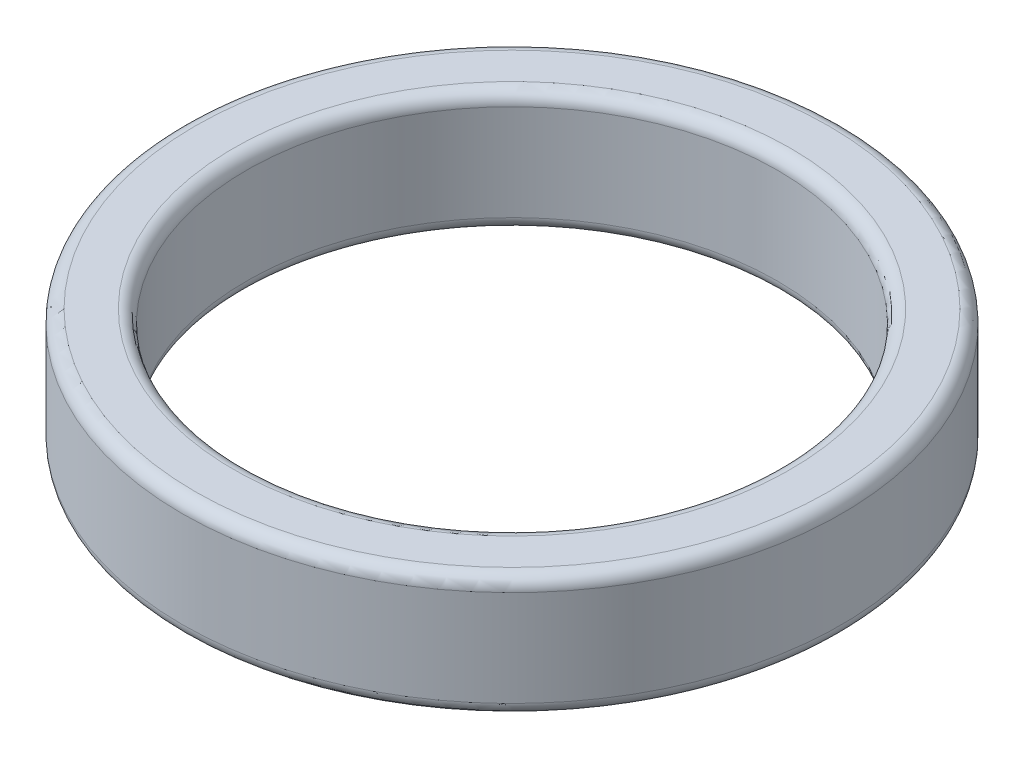
ISO-10303-21;
HEADER;
FILE_DESCRIPTION(('STEP AP214'),'2;1');
FILE_NAME('part.step','',(''),(''),'','','');
FILE_SCHEMA(('AUTOMOTIVE_DESIGN { 1 0 10303 214 1 1 1 1 }'));
ENDSEC;
DATA;
#1=APPLICATION_CONTEXT('core data for automotive mechanical design processes');
#2=APPLICATION_PROTOCOL_DEFINITION('international standard','automotive_design',2000,#1);
#3=PRODUCT_CONTEXT('',#1,'mechanical');
#4=PRODUCT('Part','Part','',(#3));
#5=PRODUCT_RELATED_PRODUCT_CATEGORY('part','',(#4));
#6=PRODUCT_DEFINITION_FORMATION('','',#4);
#7=PRODUCT_DEFINITION_CONTEXT('part definition',#1,'design');
#8=PRODUCT_DEFINITION('design','',#6,#7);
#9=PRODUCT_DEFINITION_SHAPE('','',#8);
#10=(LENGTH_UNIT() NAMED_UNIT(*) SI_UNIT(.MILLI.,.METRE.));
#11=(NAMED_UNIT(*) PLANE_ANGLE_UNIT() SI_UNIT($,.RADIAN.));
#12=(NAMED_UNIT(*) SI_UNIT($,.STERADIAN.) SOLID_ANGLE_UNIT());
#13=UNCERTAINTY_MEASURE_WITH_UNIT(LENGTH_MEASURE(1.E-05),#10,'distance_accuracy_value','');
#14=(GEOMETRIC_REPRESENTATION_CONTEXT(3) GLOBAL_UNCERTAINTY_ASSIGNED_CONTEXT((#13)) GLOBAL_UNIT_ASSIGNED_CONTEXT((#10,
#11,#12)) REPRESENTATION_CONTEXT('',''));
#15=CARTESIAN_POINT('',(0.,0.,0.));
#16=DIRECTION('',(0.,0.,1.));
#17=DIRECTION('',(1.,0.,0.));
#18=AXIS2_PLACEMENT_3D('',#15,#16,#17);
#19=CARTESIAN_POINT('',(0.,2.,0.));
#20=DIRECTION('',(0.,-1.,0.));
#21=DIRECTION('',(0.,0.,-1.));
#22=AXIS2_PLACEMENT_3D('',#19,#20,#21);
#23=TOROIDAL_SURFACE('',#22,4.35,0.2);
#24=CARTESIAN_POINT('',(0.,2.2,0.));
#25=DIRECTION('',(0.,-1.,0.));
#26=DIRECTION('',(0.,0.,-1.));
#27=AXIS2_PLACEMENT_3D('',#24,#25,#26);
#28=CIRCLE('',#27,4.35);
#29=CARTESIAN_POINT('',(0.,2.2,-4.35));
#30=VERTEX_POINT('',#29);
#31=EDGE_CURVE('E10',#30,#30,#28,.T.);
#32=ORIENTED_EDGE('',*,*,#31,.F.);
#33=EDGE_LOOP('',(#32));
#34=FACE_BOUND('',#33,.T.);
#35=CARTESIAN_POINT('',(0.,2.,0.));
#36=DIRECTION('',(0.,-1.,0.));
#37=DIRECTION('',(0.,0.,-1.));
#38=AXIS2_PLACEMENT_3D('',#35,#36,#37);
#39=CIRCLE('',#38,4.15);
#40=CARTESIAN_POINT('',(0.,2.,-4.15));
#41=VERTEX_POINT('',#40);
#42=EDGE_CURVE('E60',#41,#41,#39,.T.);
#43=ORIENTED_EDGE('',*,*,#42,.T.);
#44=EDGE_LOOP('',(#43));
#45=FACE_BOUND('',#44,.T.);
#46=ADVANCED_FACE('F32',(#34,#45),#23,.T.);
#47=CARTESIAN_POINT('',(-4.95,2.2,0.));
#48=DIRECTION('',(0.,-1.,0.));
#49=DIRECTION('',(0.,0.,-1.));
#50=AXIS2_PLACEMENT_3D('',#47,#48,#49);
#51=PLANE('',#50);
#52=CARTESIAN_POINT('',(0.,2.2,0.));
#53=DIRECTION('',(0.,-1.,0.));
#54=DIRECTION('',(0.,0.,-1.));
#55=AXIS2_PLACEMENT_3D('',#52,#53,#54);
#56=CIRCLE('',#55,4.95);
#57=CARTESIAN_POINT('',(0.,2.2,-4.95));
#58=VERTEX_POINT('',#57);
#59=EDGE_CURVE('E38',#58,#58,#56,.T.);
#60=ORIENTED_EDGE('',*,*,#59,.F.);
#61=EDGE_LOOP('',(#60));
#62=FACE_BOUND('',#61,.T.);
#63=ORIENTED_EDGE('',*,*,#31,.T.);
#64=EDGE_LOOP('',(#63));
#65=FACE_BOUND('',#64,.T.);
#66=ADVANCED_FACE('F97',(#62,#65),#51,.F.);
#67=CARTESIAN_POINT('',(0.,2.,0.));
#68=DIRECTION('',(0.,-1.,0.));
#69=DIRECTION('',(0.,0.,-1.));
#70=AXIS2_PLACEMENT_3D('',#67,#68,#69);
#71=TOROIDAL_SURFACE('',#70,4.95,0.2);
#72=CARTESIAN_POINT('',(0.,2.,0.));
#73=DIRECTION('',(0.,-1.,0.));
#74=DIRECTION('',(0.,0.,-1.));
#75=AXIS2_PLACEMENT_3D('',#72,#73,#74);
#76=CIRCLE('',#75,5.15);
#77=CARTESIAN_POINT('',(0.,2.,-5.15));
#78=VERTEX_POINT('',#77);
#79=EDGE_CURVE('E42',#78,#78,#76,.T.);
#80=ORIENTED_EDGE('',*,*,#79,.F.);
#81=EDGE_LOOP('',(#80));
#82=FACE_BOUND('',#81,.T.);
#83=ORIENTED_EDGE('',*,*,#59,.T.);
#84=EDGE_LOOP('',(#83));
#85=FACE_BOUND('',#84,.T.);
#86=ADVANCED_FACE('F92',(#82,#85),#71,.T.);
#87=CARTESIAN_POINT('',(0.,0.,0.));
#88=DIRECTION('',(0.,-1.,0.));
#89=DIRECTION('',(0.,0.,-1.));
#90=AXIS2_PLACEMENT_3D('',#87,#88,#89);
#91=CYLINDRICAL_SURFACE('',#90,5.15);
#92=CARTESIAN_POINT('',(0.,0.5,0.));
#93=DIRECTION('',(0.,-1.,0.));
#94=DIRECTION('',(0.,0.,-1.));
#95=AXIS2_PLACEMENT_3D('',#92,#93,#94);
#96=CIRCLE('',#95,5.15);
#97=CARTESIAN_POINT('',(0.,0.5,-5.15));
#98=VERTEX_POINT('',#97);
#99=EDGE_CURVE('E46',#98,#98,#96,.T.);
#100=ORIENTED_EDGE('',*,*,#99,.F.);
#101=EDGE_LOOP('',(#100));
#102=FACE_BOUND('',#101,.T.);
#103=ORIENTED_EDGE('',*,*,#79,.T.);
#104=EDGE_LOOP('',(#103));
#105=FACE_BOUND('',#104,.T.);
#106=ADVANCED_FACE('F86',(#102,#105),#91,.T.);
#107=CARTESIAN_POINT('',(0.,0.5,0.));
#108=DIRECTION('',(0.,-1.,0.));
#109=DIRECTION('',(0.,0.,-1.));
#110=AXIS2_PLACEMENT_3D('',#107,#108,#109);
#111=TOROIDAL_SURFACE('',#110,4.95,0.2);
#112=CARTESIAN_POINT('',(0.,0.3,0.));
#113=DIRECTION('',(0.,-1.,0.));
#114=DIRECTION('',(0.,0.,-1.));
#115=AXIS2_PLACEMENT_3D('',#112,#113,#114);
#116=CIRCLE('',#115,4.95);
#117=CARTESIAN_POINT('',(0.,0.3,-4.95));
#118=VERTEX_POINT('',#117);
#119=EDGE_CURVE('E51',#118,#118,#116,.T.);
#120=ORIENTED_EDGE('',*,*,#119,.F.);
#121=EDGE_LOOP('',(#120));
#122=FACE_BOUND('',#121,.T.);
#123=ORIENTED_EDGE('',*,*,#99,.T.);
#124=EDGE_LOOP('',(#123));
#125=FACE_BOUND('',#124,.T.);
#126=ADVANCED_FACE('F80',(#122,#125),#111,.T.);
#127=CARTESIAN_POINT('',(-4.35,0.3,0.));
#128=DIRECTION('',(0.,1.,0.));
#129=DIRECTION('',(0.,0.,1.));
#130=AXIS2_PLACEMENT_3D('',#127,#128,#129);
#131=PLANE('',#130);
#132=CARTESIAN_POINT('',(0.,0.3,0.));
#133=DIRECTION('',(0.,-1.,0.));
#134=DIRECTION('',(0.,0.,-1.));
#135=AXIS2_PLACEMENT_3D('',#132,#133,#134);
#136=CIRCLE('',#135,4.35);
#137=CARTESIAN_POINT('',(0.,0.3,-4.35));
#138=VERTEX_POINT('',#137);
#139=EDGE_CURVE('E54',#138,#138,#136,.T.);
#140=ORIENTED_EDGE('',*,*,#139,.F.);
#141=EDGE_LOOP('',(#140));
#142=FACE_BOUND('',#141,.T.);
#143=ORIENTED_EDGE('',*,*,#119,.T.);
#144=EDGE_LOOP('',(#143));
#145=FACE_BOUND('',#144,.T.);
#146=ADVANCED_FACE('F74',(#142,#145),#131,.F.);
#147=CARTESIAN_POINT('',(0.,0.5,0.));
#148=DIRECTION('',(0.,-1.,0.));
#149=DIRECTION('',(0.,0.,-1.));
#150=AXIS2_PLACEMENT_3D('',#147,#148,#149);
#151=TOROIDAL_SURFACE('',#150,4.35,0.2);
#152=CARTESIAN_POINT('',(0.,0.5,0.));
#153=DIRECTION('',(0.,-1.,0.));
#154=DIRECTION('',(0.,0.,-1.));
#155=AXIS2_PLACEMENT_3D('',#152,#153,#154);
#156=CIRCLE('',#155,4.15);
#157=CARTESIAN_POINT('',(0.,0.5,-4.15));
#158=VERTEX_POINT('',#157);
#159=EDGE_CURVE('E57',#158,#158,#156,.T.);
#160=ORIENTED_EDGE('',*,*,#159,.F.);
#161=EDGE_LOOP('',(#160));
#162=FACE_BOUND('',#161,.T.);
#163=ORIENTED_EDGE('',*,*,#139,.T.);
#164=EDGE_LOOP('',(#163));
#165=FACE_BOUND('',#164,.T.);
#166=ADVANCED_FACE('F68',(#162,#165),#151,.T.);
#167=CARTESIAN_POINT('',(0.,0.,0.));
#168=DIRECTION('',(0.,-1.,0.));
#169=DIRECTION('',(0.,0.,-1.));
#170=AXIS2_PLACEMENT_3D('',#167,#168,#169);
#171=CYLINDRICAL_SURFACE('',#170,4.15);
#172=ORIENTED_EDGE('',*,*,#42,.F.);
#173=EDGE_LOOP('',(#172));
#174=FACE_BOUND('',#173,.T.);
#175=ORIENTED_EDGE('',*,*,#159,.T.);
#176=EDGE_LOOP('',(#175));
#177=FACE_BOUND('',#176,.T.);
#178=ADVANCED_FACE('F65',(#174,#177),#171,.F.);
#179=CLOSED_SHELL('',(#46,#66,#86,#106,#126,#146,#166,#178));
#180=MANIFOLD_SOLID_BREP('B2',#179);
#181=ADVANCED_BREP_SHAPE_REPRESENTATION('',(#18,#180),#14);
#182=SHAPE_DEFINITION_REPRESENTATION(#9,#181);
ENDSEC;
END-ISO-10303-21;
